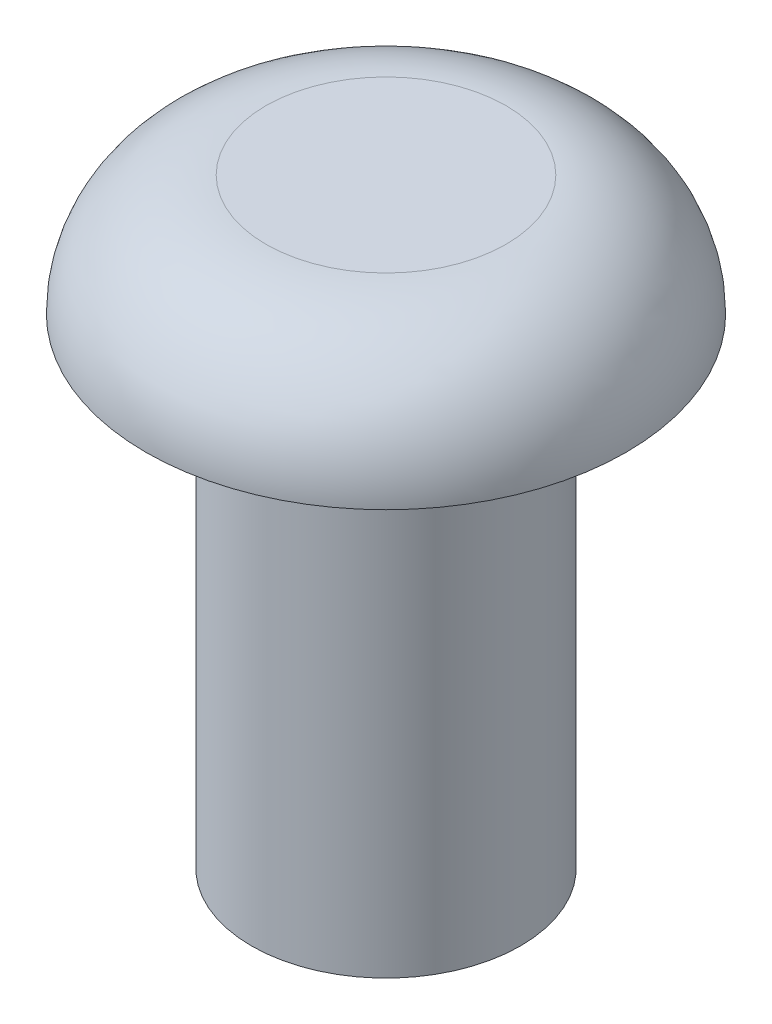
ISO-10303-21;
HEADER;
FILE_DESCRIPTION(('STEP AP214'),'2;1');
FILE_NAME('part.step','',(''),(''),'','','');
FILE_SCHEMA(('AUTOMOTIVE_DESIGN { 1 0 10303 214 1 1 1 1 }'));
ENDSEC;
DATA;
#1=APPLICATION_CONTEXT('core data for automotive mechanical design processes');
#2=APPLICATION_PROTOCOL_DEFINITION('international standard','automotive_design',2000,#1);
#3=PRODUCT_CONTEXT('',#1,'mechanical');
#4=PRODUCT('Part','Part','',(#3));
#5=PRODUCT_RELATED_PRODUCT_CATEGORY('part','',(#4));
#6=PRODUCT_DEFINITION_FORMATION('','',#4);
#7=PRODUCT_DEFINITION_CONTEXT('part definition',#1,'design');
#8=PRODUCT_DEFINITION('design','',#6,#7);
#9=PRODUCT_DEFINITION_SHAPE('','',#8);
#10=(LENGTH_UNIT() NAMED_UNIT(*) SI_UNIT(.MILLI.,.METRE.));
#11=(NAMED_UNIT(*) PLANE_ANGLE_UNIT() SI_UNIT($,.RADIAN.));
#12=(NAMED_UNIT(*) SI_UNIT($,.STERADIAN.) SOLID_ANGLE_UNIT());
#13=UNCERTAINTY_MEASURE_WITH_UNIT(LENGTH_MEASURE(1.E-05),#10,'distance_accuracy_value','');
#14=(GEOMETRIC_REPRESENTATION_CONTEXT(3) GLOBAL_UNCERTAINTY_ASSIGNED_CONTEXT((#13)) GLOBAL_UNIT_ASSIGNED_CONTEXT((#10,
#11,#12)) REPRESENTATION_CONTEXT('',''));
#15=CARTESIAN_POINT('',(0.,0.,0.));
#16=DIRECTION('',(0.,0.,1.));
#17=DIRECTION('',(1.,0.,0.));
#18=AXIS2_PLACEMENT_3D('',#15,#16,#17);
#19=CARTESIAN_POINT('',(0.,7.9375,0.));
#20=DIRECTION('',(0.,1.,0.));
#21=DIRECTION('',(0.,0.,1.));
#22=AXIS2_PLACEMENT_3D('',#19,#20,#21);
#23=PLANE('',#22);
#24=CARTESIAN_POINT('',(0.,7.9375,0.));
#25=DIRECTION('',(0.,-1.,0.));
#26=DIRECTION('',(0.,0.,-1.));
#27=AXIS2_PLACEMENT_3D('',#24,#25,#26);
#28=CIRCLE('',#27,1.5875);
#29=CARTESIAN_POINT('',(0.,7.9375,-1.5875));
#30=VERTEX_POINT('',#29);
#31=EDGE_CURVE('E10',#30,#30,#28,.T.);
#32=ORIENTED_EDGE('',*,*,#31,.F.);
#33=EDGE_LOOP('',(#32));
#34=FACE_BOUND('',#33,.T.);
#35=ADVANCED_FACE('F31',(#34),#23,.T.);
#36=CARTESIAN_POINT('',(0.,6.35,0.));
#37=DIRECTION('',(0.,-1.,0.));
#38=DIRECTION('',(0.,0.,-1.));
#39=AXIS2_PLACEMENT_3D('',#36,#37,#38);
#40=DEGENERATE_TOROIDAL_SURFACE('',#39,1.5875,1.5875,.T.);
#41=ORIENTED_EDGE('',*,*,#31,.T.);
#42=EDGE_LOOP('',(#41));
#43=FACE_BOUND('',#42,.T.);
#44=CARTESIAN_POINT('',(0.,6.35,0.));
#45=DIRECTION('',(0.,-1.,0.));
#46=DIRECTION('',(0.,0.,-1.));
#47=AXIS2_PLACEMENT_3D('',#44,#45,#46);
#48=CIRCLE('',#47,3.175);
#49=CARTESIAN_POINT('',(0.,6.35,-3.175));
#50=VERTEX_POINT('',#49);
#51=EDGE_CURVE('E37',#50,#50,#48,.T.);
#52=ORIENTED_EDGE('',*,*,#51,.F.);
#53=EDGE_LOOP('',(#52));
#54=FACE_BOUND('',#53,.T.);
#55=ADVANCED_FACE('F63',(#43,#54),#40,.T.);
#56=CARTESIAN_POINT('',(0.,6.35,-1.778));
#57=DIRECTION('',(0.,-1.,0.));
#58=DIRECTION('',(0.,0.,-1.));
#59=AXIS2_PLACEMENT_3D('',#56,#57,#58);
#60=PLANE('',#59);
#61=ORIENTED_EDGE('',*,*,#51,.T.);
#62=EDGE_LOOP('',(#61));
#63=FACE_BOUND('',#62,.T.);
#64=CARTESIAN_POINT('',(0.,6.35,0.));
#65=DIRECTION('',(0.,-1.,0.));
#66=DIRECTION('',(0.,0.,-1.));
#67=AXIS2_PLACEMENT_3D('',#64,#65,#66);
#68=CIRCLE('',#67,1.778);
#69=CARTESIAN_POINT('',(0.,6.35,-1.778));
#70=VERTEX_POINT('',#69);
#71=EDGE_CURVE('E41',#70,#70,#68,.T.);
#72=ORIENTED_EDGE('',*,*,#71,.F.);
#73=EDGE_LOOP('',(#72));
#74=FACE_BOUND('',#73,.T.);
#75=ADVANCED_FACE('F55',(#63,#74),#60,.T.);
#76=CARTESIAN_POINT('',(0.,0.,0.));
#77=DIRECTION('',(0.,-1.,0.));
#78=DIRECTION('',(0.,0.,-1.));
#79=AXIS2_PLACEMENT_3D('',#76,#77,#78);
#80=CYLINDRICAL_SURFACE('',#79,1.778);
#81=ORIENTED_EDGE('',*,*,#71,.T.);
#82=EDGE_LOOP('',(#81));
#83=FACE_BOUND('',#82,.T.);
#84=CARTESIAN_POINT('',(0.,0.,0.));
#85=DIRECTION('',(0.,-1.,0.));
#86=DIRECTION('',(0.,0.,-1.));
#87=AXIS2_PLACEMENT_3D('',#84,#85,#86);
#88=CIRCLE('',#87,1.778);
#89=CARTESIAN_POINT('',(0.,0.,-1.778));
#90=VERTEX_POINT('',#89);
#91=EDGE_CURVE('E45',#90,#90,#88,.T.);
#92=ORIENTED_EDGE('',*,*,#91,.F.);
#93=EDGE_LOOP('',(#92));
#94=FACE_BOUND('',#93,.T.);
#95=ADVANCED_FACE('F53',(#83,#94),#80,.T.);
#96=CARTESIAN_POINT('',(0.,0.,0.));
#97=DIRECTION('',(0.,-1.,0.));
#98=DIRECTION('',(0.,0.,-1.));
#99=AXIS2_PLACEMENT_3D('',#96,#97,#98);
#100=PLANE('',#99);
#101=ORIENTED_EDGE('',*,*,#91,.T.);
#102=EDGE_LOOP('',(#101));
#103=FACE_BOUND('',#102,.T.);
#104=ADVANCED_FACE('F51',(#103),#100,.T.);
#105=CLOSED_SHELL('',(#35,#55,#75,#95,#104));
#106=MANIFOLD_SOLID_BREP('B2',#105);
#107=ADVANCED_BREP_SHAPE_REPRESENTATION('',(#18,#106),#14);
#108=SHAPE_DEFINITION_REPRESENTATION(#9,#107);
ENDSEC;
END-ISO-10303-21;
